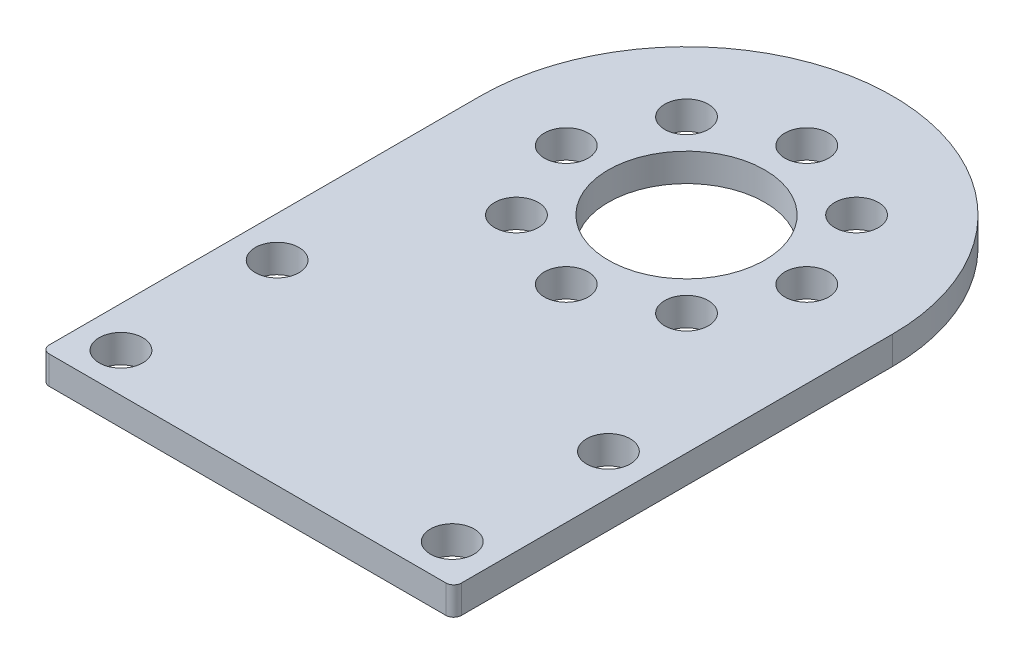
ISO-10303-21;
HEADER;
FILE_DESCRIPTION(('STEP AP214'),'2;1');
FILE_NAME('part.step','',(''),(''),'','','');
FILE_SCHEMA(('AUTOMOTIVE_DESIGN { 1 0 10303 214 1 1 1 1 }'));
ENDSEC;
DATA;
#1=APPLICATION_CONTEXT('core data for automotive mechanical design processes');
#2=APPLICATION_PROTOCOL_DEFINITION('international standard','automotive_design',2000,#1);
#3=PRODUCT_CONTEXT('',#1,'mechanical');
#4=PRODUCT('Part','Part','',(#3));
#5=PRODUCT_RELATED_PRODUCT_CATEGORY('part','',(#4));
#6=PRODUCT_DEFINITION_FORMATION('','',#4);
#7=PRODUCT_DEFINITION_CONTEXT('part definition',#1,'design');
#8=PRODUCT_DEFINITION('design','',#6,#7);
#9=PRODUCT_DEFINITION_SHAPE('','',#8);
#10=(LENGTH_UNIT() NAMED_UNIT(*) SI_UNIT(.MILLI.,.METRE.));
#11=(NAMED_UNIT(*) PLANE_ANGLE_UNIT() SI_UNIT($,.RADIAN.));
#12=(NAMED_UNIT(*) SI_UNIT($,.STERADIAN.) SOLID_ANGLE_UNIT());
#13=UNCERTAINTY_MEASURE_WITH_UNIT(LENGTH_MEASURE(1.E-05),#10,'distance_accuracy_value','');
#14=(GEOMETRIC_REPRESENTATION_CONTEXT(3) GLOBAL_UNCERTAINTY_ASSIGNED_CONTEXT((#13)) GLOBAL_UNIT_ASSIGNED_CONTEXT((#10,
#11,#12)) REPRESENTATION_CONTEXT('',''));
#15=CARTESIAN_POINT('',(0.,0.,0.));
#16=DIRECTION('',(0.,0.,1.));
#17=DIRECTION('',(1.,0.,0.));
#18=AXIS2_PLACEMENT_3D('',#15,#16,#17);
#19=CARTESIAN_POINT('',(16.129,0.,35.060382));
#20=DIRECTION('',(0.,1.,0.));
#21=DIRECTION('',(0.,0.,1.));
#22=AXIS2_PLACEMENT_3D('',#19,#20,#21);
#23=CYLINDRICAL_SURFACE('',#22,0.634999999999998);
#24=CARTESIAN_POINT('',(16.129,2.286,35.060382));
#25=DIRECTION('',(0.,1.,0.));
#26=DIRECTION('',(0.,0.,1.));
#27=AXIS2_PLACEMENT_3D('',#24,#25,#26);
#28=CIRCLE('',#27,0.634999999999998);
#29=CARTESIAN_POINT('',(16.129,2.286,35.695382));
#30=VERTEX_POINT('',#29);
#31=CARTESIAN_POINT('',(16.764,2.286,35.060382));
#32=VERTEX_POINT('',#31);
#33=EDGE_CURVE('E117',#30,#32,#28,.T.);
#34=ORIENTED_EDGE('',*,*,#33,.F.);
#35=DIRECTION('',(0.,1.,0.));
#36=VECTOR('',#35,1.);
#37=CARTESIAN_POINT('',(16.129,0.,35.695382));
#38=LINE('',#37,#36);
#39=CARTESIAN_POINT('',(16.129,0.,35.695382));
#40=VERTEX_POINT('',#39);
#41=EDGE_CURVE('E11',#40,#30,#38,.T.);
#42=ORIENTED_EDGE('',*,*,#41,.F.);
#43=CARTESIAN_POINT('',(16.129,0.,35.060382));
#44=DIRECTION('',(0.,1.,0.));
#45=DIRECTION('',(0.,0.,1.));
#46=AXIS2_PLACEMENT_3D('',#43,#44,#45);
#47=CIRCLE('',#46,0.634999999999998);
#48=CARTESIAN_POINT('',(16.764,0.,35.060382));
#49=VERTEX_POINT('',#48);
#50=EDGE_CURVE('E132',#40,#49,#47,.T.);
#51=ORIENTED_EDGE('',*,*,#50,.T.);
#52=DIRECTION('',(0.,1.,0.));
#53=VECTOR('',#52,1.);
#54=CARTESIAN_POINT('',(16.764,0.,35.060382));
#55=LINE('',#54,#53);
#56=EDGE_CURVE('E35',#49,#32,#55,.T.);
#57=ORIENTED_EDGE('',*,*,#56,.T.);
#58=EDGE_LOOP('',(#34,#42,#51,#57));
#59=FACE_BOUND('',#58,.T.);
#60=ADVANCED_FACE('F32',(#59),#23,.T.);
#61=CARTESIAN_POINT('',(-16.129,0.,35.695382));
#62=DIRECTION('',(0.,0.,1.));
#63=DIRECTION('',(1.,0.,0.));
#64=AXIS2_PLACEMENT_3D('',#61,#62,#63);
#65=PLANE('',#64);
#66=DIRECTION('',(1.,0.,0.));
#67=VECTOR('',#66,1.);
#68=CARTESIAN_POINT('',(-16.129,2.286,35.695382));
#69=LINE('',#68,#67);
#70=CARTESIAN_POINT('',(-16.129,2.286,35.695382));
#71=VERTEX_POINT('',#70);
#72=EDGE_CURVE('E130',#71,#30,#69,.T.);
#73=ORIENTED_EDGE('',*,*,#72,.F.);
#74=DIRECTION('',(0.,1.,0.));
#75=VECTOR('',#74,1.);
#76=CARTESIAN_POINT('',(-16.129,0.,35.695382));
#77=LINE('',#76,#75);
#78=CARTESIAN_POINT('',(-16.129,0.,35.695382));
#79=VERTEX_POINT('',#78);
#80=EDGE_CURVE('E41',#79,#71,#77,.T.);
#81=ORIENTED_EDGE('',*,*,#80,.F.);
#82=DIRECTION('',(1.,0.,0.));
#83=VECTOR('',#82,1.);
#84=CARTESIAN_POINT('',(-16.129,0.,35.695382));
#85=LINE('',#84,#83);
#86=EDGE_CURVE('E107',#79,#40,#85,.T.);
#87=ORIENTED_EDGE('',*,*,#86,.T.);
#88=ORIENTED_EDGE('',*,*,#41,.T.);
#89=EDGE_LOOP('',(#73,#81,#87,#88));
#90=FACE_BOUND('',#89,.T.);
#91=ADVANCED_FACE('F140',(#90),#65,.T.);
#92=CARTESIAN_POINT('',(-16.129,0.,35.060382));
#93=DIRECTION('',(0.,1.,0.));
#94=DIRECTION('',(0.,0.,1.));
#95=AXIS2_PLACEMENT_3D('',#92,#93,#94);
#96=CYLINDRICAL_SURFACE('',#95,0.634999999999998);
#97=CARTESIAN_POINT('',(-16.129,2.286,35.060382));
#98=DIRECTION('',(0.,1.,0.));
#99=DIRECTION('',(0.,0.,1.));
#100=AXIS2_PLACEMENT_3D('',#97,#98,#99);
#101=CIRCLE('',#100,0.634999999999998);
#102=CARTESIAN_POINT('',(-16.764,2.286,35.060382));
#103=VERTEX_POINT('',#102);
#104=EDGE_CURVE('E94',#103,#71,#101,.T.);
#105=ORIENTED_EDGE('',*,*,#104,.F.);
#106=DIRECTION('',(0.,1.,0.));
#107=VECTOR('',#106,1.);
#108=CARTESIAN_POINT('',(-16.764,0.,35.060382));
#109=LINE('',#108,#107);
#110=CARTESIAN_POINT('',(-16.764,0.,35.060382));
#111=VERTEX_POINT('',#110);
#112=EDGE_CURVE('E89',#111,#103,#109,.T.);
#113=ORIENTED_EDGE('',*,*,#112,.F.);
#114=CARTESIAN_POINT('',(-16.129,0.,35.060382));
#115=DIRECTION('',(0.,1.,0.));
#116=DIRECTION('',(0.,0.,1.));
#117=AXIS2_PLACEMENT_3D('',#114,#115,#116);
#118=CIRCLE('',#117,0.634999999999998);
#119=EDGE_CURVE('E92',#111,#79,#118,.T.);
#120=ORIENTED_EDGE('',*,*,#119,.T.);
#121=ORIENTED_EDGE('',*,*,#80,.T.);
#122=EDGE_LOOP('',(#105,#113,#120,#121));
#123=FACE_BOUND('',#122,.T.);
#124=ADVANCED_FACE('F91',(#123),#96,.T.);
#125=CARTESIAN_POINT('',(-16.764,0.,0.));
#126=DIRECTION('',(-1.,0.,0.));
#127=DIRECTION('',(0.,0.,1.));
#128=AXIS2_PLACEMENT_3D('',#125,#126,#127);
#129=PLANE('',#128);
#130=DIRECTION('',(0.,0.,1.));
#131=VECTOR('',#130,1.);
#132=CARTESIAN_POINT('',(-16.764,2.286,0.));
#133=LINE('',#132,#131);
#134=CARTESIAN_POINT('',(-16.764,2.286,0.));
#135=VERTEX_POINT('',#134);
#136=EDGE_CURVE('E127',#135,#103,#133,.T.);
#137=ORIENTED_EDGE('',*,*,#136,.F.);
#138=DIRECTION('',(0.,1.,0.));
#139=VECTOR('',#138,1.);
#140=CARTESIAN_POINT('',(-16.764,0.,0.));
#141=LINE('',#140,#139);
#142=CARTESIAN_POINT('',(-16.764,0.,0.));
#143=VERTEX_POINT('',#142);
#144=EDGE_CURVE('E99',#143,#135,#141,.T.);
#145=ORIENTED_EDGE('',*,*,#144,.F.);
#146=DIRECTION('',(0.,0.,1.));
#147=VECTOR('',#146,1.);
#148=CARTESIAN_POINT('',(-16.764,0.,0.));
#149=LINE('',#148,#147);
#150=EDGE_CURVE('E105',#143,#111,#149,.T.);
#151=ORIENTED_EDGE('',*,*,#150,.T.);
#152=ORIENTED_EDGE('',*,*,#112,.T.);
#153=EDGE_LOOP('',(#137,#145,#151,#152));
#154=FACE_BOUND('',#153,.T.);
#155=ADVANCED_FACE('F109',(#154),#129,.T.);
#156=CARTESIAN_POINT('',(0.,0.,0.));
#157=DIRECTION('',(0.,1.,0.));
#158=DIRECTION('',(0.,0.,1.));
#159=AXIS2_PLACEMENT_3D('',#156,#157,#158);
#160=CYLINDRICAL_SURFACE('',#159,16.764);
#161=CARTESIAN_POINT('',(0.,2.286,0.));
#162=DIRECTION('',(0.,1.,0.));
#163=DIRECTION('',(0.,0.,1.));
#164=AXIS2_PLACEMENT_3D('',#161,#162,#163);
#165=CIRCLE('',#164,16.764);
#166=CARTESIAN_POINT('',(16.764,2.286,0.));
#167=VERTEX_POINT('',#166);
#168=EDGE_CURVE('E124',#167,#135,#165,.T.);
#169=ORIENTED_EDGE('',*,*,#168,.F.);
#170=DIRECTION('',(0.,1.,0.));
#171=VECTOR('',#170,1.);
#172=CARTESIAN_POINT('',(16.764,0.,0.));
#173=LINE('',#172,#171);
#174=CARTESIAN_POINT('',(16.764,0.,0.));
#175=VERTEX_POINT('',#174);
#176=EDGE_CURVE('E135',#175,#167,#173,.T.);
#177=ORIENTED_EDGE('',*,*,#176,.F.);
#178=CARTESIAN_POINT('',(0.,0.,0.));
#179=DIRECTION('',(0.,1.,0.));
#180=DIRECTION('',(0.,0.,1.));
#181=AXIS2_PLACEMENT_3D('',#178,#179,#180);
#182=CIRCLE('',#181,16.764);
#183=EDGE_CURVE('E110',#175,#143,#182,.T.);
#184=ORIENTED_EDGE('',*,*,#183,.T.);
#185=ORIENTED_EDGE('',*,*,#144,.T.);
#186=EDGE_LOOP('',(#169,#177,#184,#185));
#187=FACE_BOUND('',#186,.T.);
#188=ADVANCED_FACE('F153',(#187),#160,.T.);
#189=CARTESIAN_POINT('',(16.764,0.,35.060382));
#190=DIRECTION('',(1.,0.,0.));
#191=DIRECTION('',(0.,0.,-1.));
#192=AXIS2_PLACEMENT_3D('',#189,#190,#191);
#193=PLANE('',#192);
#194=DIRECTION('',(0.,0.,-1.));
#195=VECTOR('',#194,1.);
#196=CARTESIAN_POINT('',(16.764,2.286,35.060382));
#197=LINE('',#196,#195);
#198=EDGE_CURVE('E120',#32,#167,#197,.T.);
#199=ORIENTED_EDGE('',*,*,#198,.F.);
#200=ORIENTED_EDGE('',*,*,#56,.F.);
#201=DIRECTION('',(0.,0.,-1.));
#202=VECTOR('',#201,1.);
#203=CARTESIAN_POINT('',(16.764,0.,35.060382));
#204=LINE('',#203,#202);
#205=EDGE_CURVE('E112',#49,#175,#204,.T.);
#206=ORIENTED_EDGE('',*,*,#205,.T.);
#207=ORIENTED_EDGE('',*,*,#176,.T.);
#208=EDGE_LOOP('',(#199,#200,#206,#207));
#209=FACE_BOUND('',#208,.T.);
#210=ADVANCED_FACE('F137',(#209),#193,.T.);
#211=CARTESIAN_POINT('',(16.129,0.,35.060382));
#212=DIRECTION('',(0.,1.,0.));
#213=DIRECTION('',(0.,0.,1.));
#214=AXIS2_PLACEMENT_3D('',#211,#212,#213);
#215=PLANE('',#214);
#216=CARTESIAN_POINT('',(-13.4703841816037,0.,19.820382));
#217=DIRECTION('',(0.,1.,0.));
#218=DIRECTION('',(0.,0.,1.));
#219=AXIS2_PLACEMENT_3D('',#216,#217,#218);
#220=CIRCLE('',#219,1.778);
#221=CARTESIAN_POINT('',(-13.4703841816037,0.,21.598382));
#222=VERTEX_POINT('',#221);
#223=EDGE_CURVE('E227',#222,#222,#220,.T.);
#224=ORIENTED_EDGE('',*,*,#223,.T.);
#225=EDGE_LOOP('',(#224));
#226=FACE_BOUND('',#225,.T.);
#227=CARTESIAN_POINT('',(13.4703841816037,0.,19.820382));
#228=DIRECTION('',(0.,1.,0.));
#229=DIRECTION('',(0.,0.,1.));
#230=AXIS2_PLACEMENT_3D('',#227,#228,#229);
#231=CIRCLE('',#230,1.778);
#232=CARTESIAN_POINT('',(13.4703841816037,0.,21.598382));
#233=VERTEX_POINT('',#232);
#234=EDGE_CURVE('E231',#233,#233,#231,.T.);
#235=ORIENTED_EDGE('',*,*,#234,.T.);
#236=EDGE_LOOP('',(#235));
#237=FACE_BOUND('',#236,.T.);
#238=CARTESIAN_POINT('',(-13.4703841816037,0.,32.520382));
#239=DIRECTION('',(0.,1.,0.));
#240=DIRECTION('',(0.,0.,-1.));
#241=AXIS2_PLACEMENT_3D('',#238,#239,#240);
#242=CIRCLE('',#241,1.77799999999999);
#243=CARTESIAN_POINT('',(-13.4703841816037,0.,30.742382));
#244=VERTEX_POINT('',#243);
#245=EDGE_CURVE('E238',#244,#244,#242,.T.);
#246=ORIENTED_EDGE('',*,*,#245,.T.);
#247=EDGE_LOOP('',(#246));
#248=FACE_BOUND('',#247,.T.);
#249=CARTESIAN_POINT('',(13.4703841816037,0.,32.520382));
#250=DIRECTION('',(0.,1.,0.));
#251=DIRECTION('',(0.,0.,-1.));
#252=AXIS2_PLACEMENT_3D('',#249,#250,#251);
#253=CIRCLE('',#252,1.77799999999999);
#254=CARTESIAN_POINT('',(13.4703841816037,0.,30.742382));
#255=VERTEX_POINT('',#254);
#256=EDGE_CURVE('E244',#255,#255,#253,.T.);
#257=ORIENTED_EDGE('',*,*,#256,.T.);
#258=EDGE_LOOP('',(#257));
#259=FACE_BOUND('',#258,.T.);
#260=CARTESIAN_POINT('',(6.91479721322333,0.,6.91479721322316));
#261=DIRECTION('',(0.,1.,0.));
#262=DIRECTION('',(0.,0.,-1.));
#263=AXIS2_PLACEMENT_3D('',#260,#261,#262);
#264=CIRCLE('',#263,1.778);
#265=CARTESIAN_POINT('',(6.91479721322333,0.,5.13679721322316));
#266=VERTEX_POINT('',#265);
#267=EDGE_CURVE('E250',#266,#266,#264,.T.);
#268=ORIENTED_EDGE('',*,*,#267,.T.);
#269=EDGE_LOOP('',(#268));
#270=FACE_BOUND('',#269,.T.);
#271=CARTESIAN_POINT('',(1.02429588037641E-13,0.,9.779));
#272=DIRECTION('',(0.,1.,0.));
#273=DIRECTION('',(0.,0.,-1.));
#274=AXIS2_PLACEMENT_3D('',#271,#272,#273);
#275=CIRCLE('',#274,1.778);
#276=CARTESIAN_POINT('',(1.02429588037641E-13,0.,8.001));
#277=VERTEX_POINT('',#276);
#278=EDGE_CURVE('E256',#277,#277,#275,.T.);
#279=ORIENTED_EDGE('',*,*,#278,.T.);
#280=EDGE_LOOP('',(#279));
#281=FACE_BOUND('',#280,.T.);
#282=CARTESIAN_POINT('',(-6.91479721322319,0.,6.91479721322331));
#283=DIRECTION('',(0.,1.,0.));
#284=DIRECTION('',(0.,0.,-1.));
#285=AXIS2_PLACEMENT_3D('',#282,#283,#284);
#286=CIRCLE('',#285,1.778);
#287=CARTESIAN_POINT('',(-6.91479721322319,0.,5.13679721322331));
#288=VERTEX_POINT('',#287);
#289=EDGE_CURVE('E262',#288,#288,#286,.T.);
#290=ORIENTED_EDGE('',*,*,#289,.T.);
#291=EDGE_LOOP('',(#290));
#292=FACE_BOUND('',#291,.T.);
#293=CARTESIAN_POINT('',(-9.779,0.,0.));
#294=DIRECTION('',(0.,1.,0.));
#295=DIRECTION('',(0.,0.,-1.));
#296=AXIS2_PLACEMENT_3D('',#293,#294,#295);
#297=CIRCLE('',#296,1.778);
#298=CARTESIAN_POINT('',(-9.779,0.,-1.778));
#299=VERTEX_POINT('',#298);
#300=EDGE_CURVE('E268',#299,#299,#297,.T.);
#301=ORIENTED_EDGE('',*,*,#300,.T.);
#302=EDGE_LOOP('',(#301));
#303=FACE_BOUND('',#302,.T.);
#304=CARTESIAN_POINT('',(-6.91479721322328,0.,-6.91479721322321));
#305=DIRECTION('',(0.,1.,0.));
#306=DIRECTION('',(0.,0.,-1.));
#307=AXIS2_PLACEMENT_3D('',#304,#305,#306);
#308=CIRCLE('',#307,1.778);
#309=CARTESIAN_POINT('',(-6.91479721322328,0.,-8.69279721322321));
#310=VERTEX_POINT('',#309);
#311=EDGE_CURVE('E274',#310,#310,#308,.T.);
#312=ORIENTED_EDGE('',*,*,#311,.T.);
#313=EDGE_LOOP('',(#312));
#314=FACE_BOUND('',#313,.T.);
#315=CARTESIAN_POINT('',(0.,0.,-9.779));
#316=DIRECTION('',(0.,1.,0.));
#317=DIRECTION('',(0.,0.,-1.));
#318=AXIS2_PLACEMENT_3D('',#315,#316,#317);
#319=CIRCLE('',#318,1.778);
#320=CARTESIAN_POINT('',(0.,0.,-11.557));
#321=VERTEX_POINT('',#320);
#322=EDGE_CURVE('E280',#321,#321,#319,.T.);
#323=ORIENTED_EDGE('',*,*,#322,.T.);
#324=EDGE_LOOP('',(#323));
#325=FACE_BOUND('',#324,.T.);
#326=CARTESIAN_POINT('',(6.91479721322324,0.,-6.91479721322326));
#327=DIRECTION('',(0.,1.,0.));
#328=DIRECTION('',(0.,0.,-1.));
#329=AXIS2_PLACEMENT_3D('',#326,#327,#328);
#330=CIRCLE('',#329,1.778);
#331=CARTESIAN_POINT('',(6.91479721322324,0.,-8.69279721322326));
#332=VERTEX_POINT('',#331);
#333=EDGE_CURVE('E286',#332,#332,#330,.T.);
#334=ORIENTED_EDGE('',*,*,#333,.T.);
#335=EDGE_LOOP('',(#334));
#336=FACE_BOUND('',#335,.T.);
#337=CARTESIAN_POINT('',(9.779,0.,0.));
#338=DIRECTION('',(0.,1.,0.));
#339=DIRECTION('',(0.,0.,-1.));
#340=AXIS2_PLACEMENT_3D('',#337,#338,#339);
#341=CIRCLE('',#340,1.778);
#342=CARTESIAN_POINT('',(9.779,0.,-1.778));
#343=VERTEX_POINT('',#342);
#344=EDGE_CURVE('E292',#343,#343,#341,.T.);
#345=ORIENTED_EDGE('',*,*,#344,.T.);
#346=EDGE_LOOP('',(#345));
#347=FACE_BOUND('',#346,.T.);
#348=CARTESIAN_POINT('',(0.,0.,0.));
#349=DIRECTION('',(0.,1.,0.));
#350=DIRECTION('',(0.,0.,-1.));
#351=AXIS2_PLACEMENT_3D('',#348,#349,#350);
#352=CIRCLE('',#351,6.3627);
#353=CARTESIAN_POINT('',(0.,0.,-6.3627));
#354=VERTEX_POINT('',#353);
#355=EDGE_CURVE('E121',#354,#354,#352,.T.);
#356=ORIENTED_EDGE('',*,*,#355,.T.);
#357=EDGE_LOOP('',(#356));
#358=FACE_BOUND('',#357,.T.);
#359=ORIENTED_EDGE('',*,*,#50,.F.);
#360=ORIENTED_EDGE('',*,*,#86,.F.);
#361=ORIENTED_EDGE('',*,*,#119,.F.);
#362=ORIENTED_EDGE('',*,*,#150,.F.);
#363=ORIENTED_EDGE('',*,*,#183,.F.);
#364=ORIENTED_EDGE('',*,*,#205,.F.);
#365=EDGE_LOOP('',(#359,#360,#361,#362,#363,#364));
#366=FACE_BOUND('',#365,.T.);
#367=ADVANCED_FACE('F103',(#226,#237,#248,#259,#270,#281,#292,#303,#314,#325,#336,#347,#358,
#366),#215,.F.);
#368=CARTESIAN_POINT('',(16.129,2.286,35.060382));
#369=DIRECTION('',(0.,1.,0.));
#370=DIRECTION('',(0.,0.,1.));
#371=AXIS2_PLACEMENT_3D('',#368,#369,#370);
#372=PLANE('',#371);
#373=CARTESIAN_POINT('',(-13.4703841816037,2.286,19.820382));
#374=DIRECTION('',(0.,1.,0.));
#375=DIRECTION('',(0.,0.,1.));
#376=AXIS2_PLACEMENT_3D('',#373,#374,#375);
#377=CIRCLE('',#376,1.778);
#378=CARTESIAN_POINT('',(-13.4703841816037,2.286,21.598382));
#379=VERTEX_POINT('',#378);
#380=EDGE_CURVE('E225',#379,#379,#377,.T.);
#381=ORIENTED_EDGE('',*,*,#380,.F.);
#382=EDGE_LOOP('',(#381));
#383=FACE_BOUND('',#382,.T.);
#384=CARTESIAN_POINT('',(13.4703841816037,2.286,19.820382));
#385=DIRECTION('',(0.,1.,0.));
#386=DIRECTION('',(0.,0.,1.));
#387=AXIS2_PLACEMENT_3D('',#384,#385,#386);
#388=CIRCLE('',#387,1.778);
#389=CARTESIAN_POINT('',(13.4703841816037,2.286,21.598382));
#390=VERTEX_POINT('',#389);
#391=EDGE_CURVE('E228',#390,#390,#388,.T.);
#392=ORIENTED_EDGE('',*,*,#391,.F.);
#393=EDGE_LOOP('',(#392));
#394=FACE_BOUND('',#393,.T.);
#395=CARTESIAN_POINT('',(-13.4703841816037,2.286,32.520382));
#396=DIRECTION('',(0.,1.,0.));
#397=DIRECTION('',(0.,0.,-1.));
#398=AXIS2_PLACEMENT_3D('',#395,#396,#397);
#399=CIRCLE('',#398,1.77799999999999);
#400=CARTESIAN_POINT('',(-13.4703841816037,2.286,30.742382));
#401=VERTEX_POINT('',#400);
#402=EDGE_CURVE('E237',#401,#401,#399,.T.);
#403=ORIENTED_EDGE('',*,*,#402,.F.);
#404=EDGE_LOOP('',(#403));
#405=FACE_BOUND('',#404,.T.);
#406=CARTESIAN_POINT('',(13.4703841816037,2.286,32.520382));
#407=DIRECTION('',(0.,1.,0.));
#408=DIRECTION('',(0.,0.,-1.));
#409=AXIS2_PLACEMENT_3D('',#406,#407,#408);
#410=CIRCLE('',#409,1.77799999999999);
#411=CARTESIAN_POINT('',(13.4703841816037,2.286,30.742382));
#412=VERTEX_POINT('',#411);
#413=EDGE_CURVE('E241',#412,#412,#410,.T.);
#414=ORIENTED_EDGE('',*,*,#413,.F.);
#415=EDGE_LOOP('',(#414));
#416=FACE_BOUND('',#415,.T.);
#417=CARTESIAN_POINT('',(6.91479721322333,2.286,6.91479721322316));
#418=DIRECTION('',(0.,1.,0.));
#419=DIRECTION('',(0.,0.,-1.));
#420=AXIS2_PLACEMENT_3D('',#417,#418,#419);
#421=CIRCLE('',#420,1.778);
#422=CARTESIAN_POINT('',(6.91479721322333,2.286,5.13679721322316));
#423=VERTEX_POINT('',#422);
#424=EDGE_CURVE('E247',#423,#423,#421,.T.);
#425=ORIENTED_EDGE('',*,*,#424,.F.);
#426=EDGE_LOOP('',(#425));
#427=FACE_BOUND('',#426,.T.);
#428=CARTESIAN_POINT('',(1.02429588037641E-13,2.286,9.779));
#429=DIRECTION('',(0.,1.,0.));
#430=DIRECTION('',(0.,0.,-1.));
#431=AXIS2_PLACEMENT_3D('',#428,#429,#430);
#432=CIRCLE('',#431,1.778);
#433=CARTESIAN_POINT('',(1.02429588037641E-13,2.286,8.001));
#434=VERTEX_POINT('',#433);
#435=EDGE_CURVE('E253',#434,#434,#432,.T.);
#436=ORIENTED_EDGE('',*,*,#435,.F.);
#437=EDGE_LOOP('',(#436));
#438=FACE_BOUND('',#437,.T.);
#439=CARTESIAN_POINT('',(-6.91479721322319,2.286,6.91479721322331));
#440=DIRECTION('',(0.,1.,0.));
#441=DIRECTION('',(0.,0.,-1.));
#442=AXIS2_PLACEMENT_3D('',#439,#440,#441);
#443=CIRCLE('',#442,1.778);
#444=CARTESIAN_POINT('',(-6.91479721322319,2.286,5.13679721322331));
#445=VERTEX_POINT('',#444);
#446=EDGE_CURVE('E259',#445,#445,#443,.T.);
#447=ORIENTED_EDGE('',*,*,#446,.F.);
#448=EDGE_LOOP('',(#447));
#449=FACE_BOUND('',#448,.T.);
#450=CARTESIAN_POINT('',(-9.779,2.286,0.));
#451=DIRECTION('',(0.,1.,0.));
#452=DIRECTION('',(0.,0.,-1.));
#453=AXIS2_PLACEMENT_3D('',#450,#451,#452);
#454=CIRCLE('',#453,1.778);
#455=CARTESIAN_POINT('',(-9.779,2.286,-1.778));
#456=VERTEX_POINT('',#455);
#457=EDGE_CURVE('E265',#456,#456,#454,.T.);
#458=ORIENTED_EDGE('',*,*,#457,.F.);
#459=EDGE_LOOP('',(#458));
#460=FACE_BOUND('',#459,.T.);
#461=CARTESIAN_POINT('',(-6.91479721322328,2.286,-6.91479721322321));
#462=DIRECTION('',(0.,1.,0.));
#463=DIRECTION('',(0.,0.,-1.));
#464=AXIS2_PLACEMENT_3D('',#461,#462,#463);
#465=CIRCLE('',#464,1.778);
#466=CARTESIAN_POINT('',(-6.91479721322328,2.286,-8.69279721322321));
#467=VERTEX_POINT('',#466);
#468=EDGE_CURVE('E271',#467,#467,#465,.T.);
#469=ORIENTED_EDGE('',*,*,#468,.F.);
#470=EDGE_LOOP('',(#469));
#471=FACE_BOUND('',#470,.T.);
#472=CARTESIAN_POINT('',(0.,2.286,-9.779));
#473=DIRECTION('',(0.,1.,0.));
#474=DIRECTION('',(0.,0.,-1.));
#475=AXIS2_PLACEMENT_3D('',#472,#473,#474);
#476=CIRCLE('',#475,1.778);
#477=CARTESIAN_POINT('',(0.,2.286,-11.557));
#478=VERTEX_POINT('',#477);
#479=EDGE_CURVE('E277',#478,#478,#476,.T.);
#480=ORIENTED_EDGE('',*,*,#479,.F.);
#481=EDGE_LOOP('',(#480));
#482=FACE_BOUND('',#481,.T.);
#483=CARTESIAN_POINT('',(6.91479721322324,2.286,-6.91479721322326));
#484=DIRECTION('',(0.,1.,0.));
#485=DIRECTION('',(0.,0.,-1.));
#486=AXIS2_PLACEMENT_3D('',#483,#484,#485);
#487=CIRCLE('',#486,1.778);
#488=CARTESIAN_POINT('',(6.91479721322324,2.286,-8.69279721322326));
#489=VERTEX_POINT('',#488);
#490=EDGE_CURVE('E283',#489,#489,#487,.T.);
#491=ORIENTED_EDGE('',*,*,#490,.F.);
#492=EDGE_LOOP('',(#491));
#493=FACE_BOUND('',#492,.T.);
#494=CARTESIAN_POINT('',(9.779,2.286,0.));
#495=DIRECTION('',(0.,1.,0.));
#496=DIRECTION('',(0.,0.,-1.));
#497=AXIS2_PLACEMENT_3D('',#494,#495,#496);
#498=CIRCLE('',#497,1.778);
#499=CARTESIAN_POINT('',(9.779,2.286,-1.778));
#500=VERTEX_POINT('',#499);
#501=EDGE_CURVE('E289',#500,#500,#498,.T.);
#502=ORIENTED_EDGE('',*,*,#501,.F.);
#503=EDGE_LOOP('',(#502));
#504=FACE_BOUND('',#503,.T.);
#505=CARTESIAN_POINT('',(0.,2.286,0.));
#506=DIRECTION('',(0.,1.,0.));
#507=DIRECTION('',(0.,0.,-1.));
#508=AXIS2_PLACEMENT_3D('',#505,#506,#507);
#509=CIRCLE('',#508,6.3627);
#510=CARTESIAN_POINT('',(0.,2.286,-6.3627));
#511=VERTEX_POINT('',#510);
#512=EDGE_CURVE('E295',#511,#511,#509,.T.);
#513=ORIENTED_EDGE('',*,*,#512,.F.);
#514=EDGE_LOOP('',(#513));
#515=FACE_BOUND('',#514,.T.);
#516=ORIENTED_EDGE('',*,*,#33,.T.);
#517=ORIENTED_EDGE('',*,*,#198,.T.);
#518=ORIENTED_EDGE('',*,*,#168,.T.);
#519=ORIENTED_EDGE('',*,*,#136,.T.);
#520=ORIENTED_EDGE('',*,*,#104,.T.);
#521=ORIENTED_EDGE('',*,*,#72,.T.);
#522=EDGE_LOOP('',(#516,#517,#518,#519,#520,#521));
#523=FACE_BOUND('',#522,.T.);
#524=ADVANCED_FACE('F139',(#383,#394,#405,#416,#427,#438,#449,#460,#471,#482,#493,#504,#515,
#523),#372,.T.);
#525=CARTESIAN_POINT('',(0.,0.,0.));
#526=DIRECTION('',(0.,1.,0.));
#527=DIRECTION('',(0.,0.,1.));
#528=AXIS2_PLACEMENT_3D('',#525,#526,#527);
#529=CYLINDRICAL_SURFACE('',#528,6.3627);
#530=ORIENTED_EDGE('',*,*,#355,.F.);
#531=EDGE_LOOP('',(#530));
#532=FACE_BOUND('',#531,.T.);
#533=ORIENTED_EDGE('',*,*,#512,.T.);
#534=EDGE_LOOP('',(#533));
#535=FACE_BOUND('',#534,.T.);
#536=ADVANCED_FACE('F165',(#532,#535),#529,.F.);
#537=CARTESIAN_POINT('',(9.779,0.,0.));
#538=DIRECTION('',(0.,1.,0.));
#539=DIRECTION('',(0.,0.,1.));
#540=AXIS2_PLACEMENT_3D('',#537,#538,#539);
#541=CYLINDRICAL_SURFACE('',#540,1.778);
#542=ORIENTED_EDGE('',*,*,#344,.F.);
#543=EDGE_LOOP('',(#542));
#544=FACE_BOUND('',#543,.T.);
#545=ORIENTED_EDGE('',*,*,#501,.T.);
#546=EDGE_LOOP('',(#545));
#547=FACE_BOUND('',#546,.T.);
#548=ADVANCED_FACE('F172',(#544,#547),#541,.F.);
#549=CARTESIAN_POINT('',(6.91479721322324,0.,-6.91479721322326));
#550=DIRECTION('',(0.,1.,0.));
#551=DIRECTION('',(0.,0.,1.));
#552=AXIS2_PLACEMENT_3D('',#549,#550,#551);
#553=CYLINDRICAL_SURFACE('',#552,1.778);
#554=ORIENTED_EDGE('',*,*,#333,.F.);
#555=EDGE_LOOP('',(#554));
#556=FACE_BOUND('',#555,.T.);
#557=ORIENTED_EDGE('',*,*,#490,.T.);
#558=EDGE_LOOP('',(#557));
#559=FACE_BOUND('',#558,.T.);
#560=ADVANCED_FACE('F176',(#556,#559),#553,.F.);
#561=CARTESIAN_POINT('',(0.,0.,-9.779));
#562=DIRECTION('',(0.,1.,0.));
#563=DIRECTION('',(0.,0.,1.));
#564=AXIS2_PLACEMENT_3D('',#561,#562,#563);
#565=CYLINDRICAL_SURFACE('',#564,1.778);
#566=ORIENTED_EDGE('',*,*,#322,.F.);
#567=EDGE_LOOP('',(#566));
#568=FACE_BOUND('',#567,.T.);
#569=ORIENTED_EDGE('',*,*,#479,.T.);
#570=EDGE_LOOP('',(#569));
#571=FACE_BOUND('',#570,.T.);
#572=ADVANCED_FACE('F180',(#568,#571),#565,.F.);
#573=CARTESIAN_POINT('',(-6.91479721322328,0.,-6.91479721322321));
#574=DIRECTION('',(0.,1.,0.));
#575=DIRECTION('',(0.,0.,1.));
#576=AXIS2_PLACEMENT_3D('',#573,#574,#575);
#577=CYLINDRICAL_SURFACE('',#576,1.778);
#578=ORIENTED_EDGE('',*,*,#311,.F.);
#579=EDGE_LOOP('',(#578));
#580=FACE_BOUND('',#579,.T.);
#581=ORIENTED_EDGE('',*,*,#468,.T.);
#582=EDGE_LOOP('',(#581));
#583=FACE_BOUND('',#582,.T.);
#584=ADVANCED_FACE('F184',(#580,#583),#577,.F.);
#585=CARTESIAN_POINT('',(-9.779,0.,0.));
#586=DIRECTION('',(0.,1.,0.));
#587=DIRECTION('',(0.,0.,1.));
#588=AXIS2_PLACEMENT_3D('',#585,#586,#587);
#589=CYLINDRICAL_SURFACE('',#588,1.778);
#590=ORIENTED_EDGE('',*,*,#300,.F.);
#591=EDGE_LOOP('',(#590));
#592=FACE_BOUND('',#591,.T.);
#593=ORIENTED_EDGE('',*,*,#457,.T.);
#594=EDGE_LOOP('',(#593));
#595=FACE_BOUND('',#594,.T.);
#596=ADVANCED_FACE('F188',(#592,#595),#589,.F.);
#597=CARTESIAN_POINT('',(-6.91479721322319,0.,6.91479721322331));
#598=DIRECTION('',(0.,1.,0.));
#599=DIRECTION('',(0.,0.,1.));
#600=AXIS2_PLACEMENT_3D('',#597,#598,#599);
#601=CYLINDRICAL_SURFACE('',#600,1.778);
#602=ORIENTED_EDGE('',*,*,#289,.F.);
#603=EDGE_LOOP('',(#602));
#604=FACE_BOUND('',#603,.T.);
#605=ORIENTED_EDGE('',*,*,#446,.T.);
#606=EDGE_LOOP('',(#605));
#607=FACE_BOUND('',#606,.T.);
#608=ADVANCED_FACE('F192',(#604,#607),#601,.F.);
#609=CARTESIAN_POINT('',(1.02429588037641E-13,0.,9.779));
#610=DIRECTION('',(0.,1.,0.));
#611=DIRECTION('',(0.,0.,1.));
#612=AXIS2_PLACEMENT_3D('',#609,#610,#611);
#613=CYLINDRICAL_SURFACE('',#612,1.778);
#614=ORIENTED_EDGE('',*,*,#278,.F.);
#615=EDGE_LOOP('',(#614));
#616=FACE_BOUND('',#615,.T.);
#617=ORIENTED_EDGE('',*,*,#435,.T.);
#618=EDGE_LOOP('',(#617));
#619=FACE_BOUND('',#618,.T.);
#620=ADVANCED_FACE('F196',(#616,#619),#613,.F.);
#621=CARTESIAN_POINT('',(6.91479721322333,0.,6.91479721322316));
#622=DIRECTION('',(0.,1.,0.));
#623=DIRECTION('',(0.,0.,1.));
#624=AXIS2_PLACEMENT_3D('',#621,#622,#623);
#625=CYLINDRICAL_SURFACE('',#624,1.778);
#626=ORIENTED_EDGE('',*,*,#267,.F.);
#627=EDGE_LOOP('',(#626));
#628=FACE_BOUND('',#627,.T.);
#629=ORIENTED_EDGE('',*,*,#424,.T.);
#630=EDGE_LOOP('',(#629));
#631=FACE_BOUND('',#630,.T.);
#632=ADVANCED_FACE('F200',(#628,#631),#625,.F.);
#633=CARTESIAN_POINT('',(13.4703841816037,0.,32.520382));
#634=DIRECTION('',(0.,1.,0.));
#635=DIRECTION('',(0.,0.,1.));
#636=AXIS2_PLACEMENT_3D('',#633,#634,#635);
#637=CYLINDRICAL_SURFACE('',#636,1.77799999999999);
#638=ORIENTED_EDGE('',*,*,#256,.F.);
#639=EDGE_LOOP('',(#638));
#640=FACE_BOUND('',#639,.T.);
#641=ORIENTED_EDGE('',*,*,#413,.T.);
#642=EDGE_LOOP('',(#641));
#643=FACE_BOUND('',#642,.T.);
#644=ADVANCED_FACE('F204',(#640,#643),#637,.F.);
#645=CARTESIAN_POINT('',(-13.4703841816037,0.,32.520382));
#646=DIRECTION('',(0.,1.,0.));
#647=DIRECTION('',(0.,0.,1.));
#648=AXIS2_PLACEMENT_3D('',#645,#646,#647);
#649=CYLINDRICAL_SURFACE('',#648,1.77799999999999);
#650=ORIENTED_EDGE('',*,*,#245,.F.);
#651=EDGE_LOOP('',(#650));
#652=FACE_BOUND('',#651,.T.);
#653=ORIENTED_EDGE('',*,*,#402,.T.);
#654=EDGE_LOOP('',(#653));
#655=FACE_BOUND('',#654,.T.);
#656=ADVANCED_FACE('F208',(#652,#655),#649,.F.);
#657=CARTESIAN_POINT('',(13.4703841816037,-5.334,19.820382));
#658=DIRECTION('',(0.,1.,0.));
#659=DIRECTION('',(0.,0.,1.));
#660=AXIS2_PLACEMENT_3D('',#657,#658,#659);
#661=CYLINDRICAL_SURFACE('',#660,1.778);
#662=ORIENTED_EDGE('',*,*,#391,.T.);
#663=EDGE_LOOP('',(#662));
#664=FACE_BOUND('',#663,.T.);
#665=ORIENTED_EDGE('',*,*,#234,.F.);
#666=EDGE_LOOP('',(#665));
#667=FACE_BOUND('',#666,.T.);
#668=ADVANCED_FACE('F212',(#664,#667),#661,.F.);
#669=CARTESIAN_POINT('',(-13.4703841816037,-5.334,19.820382));
#670=DIRECTION('',(0.,1.,0.));
#671=DIRECTION('',(0.,0.,1.));
#672=AXIS2_PLACEMENT_3D('',#669,#670,#671);
#673=CYLINDRICAL_SURFACE('',#672,1.778);
#674=ORIENTED_EDGE('',*,*,#380,.T.);
#675=EDGE_LOOP('',(#674));
#676=FACE_BOUND('',#675,.T.);
#677=ORIENTED_EDGE('',*,*,#223,.F.);
#678=EDGE_LOOP('',(#677));
#679=FACE_BOUND('',#678,.T.);
#680=ADVANCED_FACE('F216',(#676,#679),#673,.F.);
#681=CLOSED_SHELL('',(#60,#91,#124,#155,#188,#210,#367,#524,#536,#548,#560,#572,#584,#596,#608,
#620,#632,#644,#656,#668,#680));
#682=MANIFOLD_SOLID_BREP('B2',#681);
#683=ADVANCED_BREP_SHAPE_REPRESENTATION('',(#18,#682),#14);
#684=SHAPE_DEFINITION_REPRESENTATION(#9,#683);
ENDSEC;
END-ISO-10303-21;
